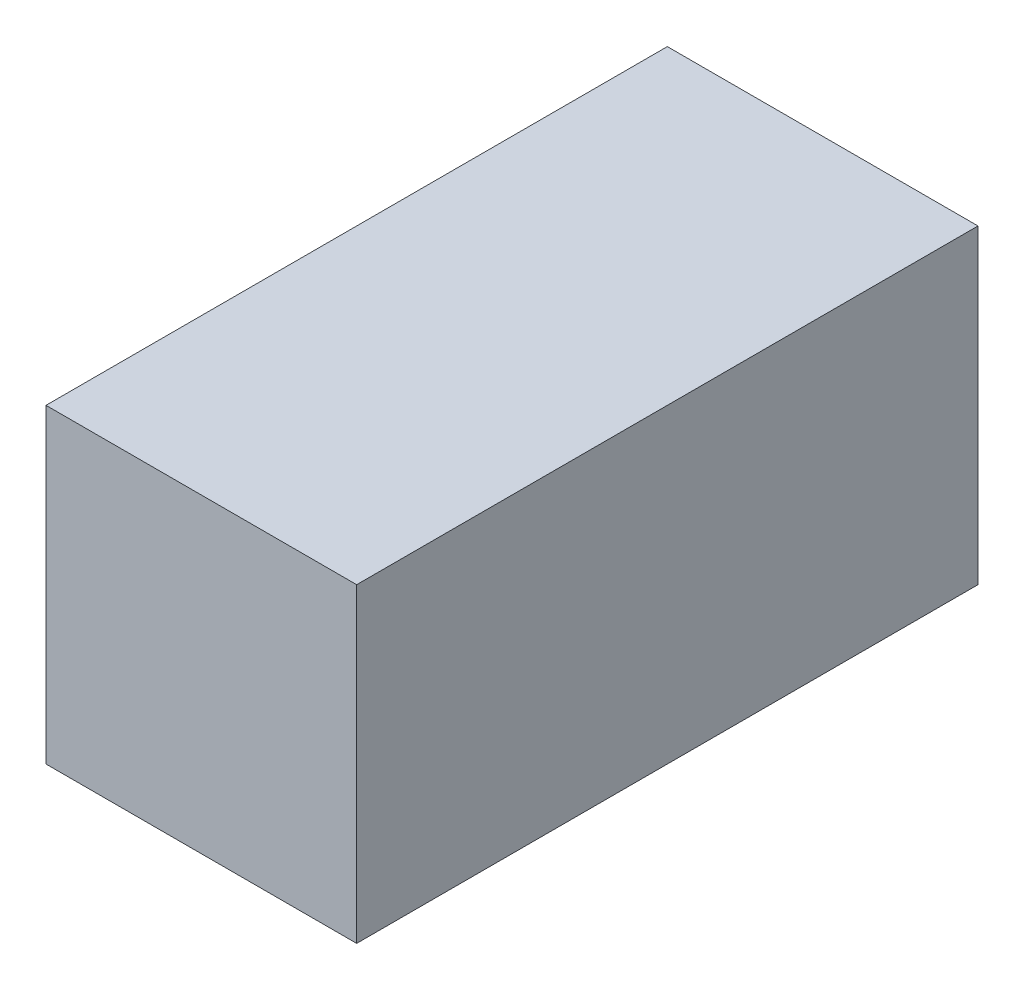
ISO-10303-21;
HEADER;
FILE_DESCRIPTION(('STEP AP214'),'2;1');
FILE_NAME('part.step','',(''),(''),'','','');
FILE_SCHEMA(('AUTOMOTIVE_DESIGN { 1 0 10303 214 1 1 1 1 }'));
ENDSEC;
DATA;
#1=APPLICATION_CONTEXT('core data for automotive mechanical design processes');
#2=APPLICATION_PROTOCOL_DEFINITION('international standard','automotive_design',2000,#1);
#3=PRODUCT_CONTEXT('',#1,'mechanical');
#4=PRODUCT('Part','Part','',(#3));
#5=PRODUCT_RELATED_PRODUCT_CATEGORY('part','',(#4));
#6=PRODUCT_DEFINITION_FORMATION('','',#4);
#7=PRODUCT_DEFINITION_CONTEXT('part definition',#1,'design');
#8=PRODUCT_DEFINITION('design','',#6,#7);
#9=PRODUCT_DEFINITION_SHAPE('','',#8);
#10=(LENGTH_UNIT() NAMED_UNIT(*) SI_UNIT(.MILLI.,.METRE.));
#11=(NAMED_UNIT(*) PLANE_ANGLE_UNIT() SI_UNIT($,.RADIAN.));
#12=(NAMED_UNIT(*) SI_UNIT($,.STERADIAN.) SOLID_ANGLE_UNIT());
#13=UNCERTAINTY_MEASURE_WITH_UNIT(LENGTH_MEASURE(1.E-05),#10,'distance_accuracy_value','');
#14=(GEOMETRIC_REPRESENTATION_CONTEXT(3) GLOBAL_UNCERTAINTY_ASSIGNED_CONTEXT((#13)) GLOBAL_UNIT_ASSIGNED_CONTEXT((#10,
#11,#12)) REPRESENTATION_CONTEXT('',''));
#15=CARTESIAN_POINT('',(0.,0.,0.));
#16=DIRECTION('',(0.,0.,1.));
#17=DIRECTION('',(1.,0.,0.));
#18=AXIS2_PLACEMENT_3D('',#15,#16,#17);
#19=CARTESIAN_POINT('',(5.,0.,10.));
#20=DIRECTION('',(-1.,0.,0.));
#21=DIRECTION('',(0.,0.,1.));
#22=AXIS2_PLACEMENT_3D('',#19,#20,#21);
#23=PLANE('',#22);
#24=DIRECTION('',(0.,1.,0.));
#25=VECTOR('',#24,1.);
#26=CARTESIAN_POINT('',(5.,0.,0.));
#27=LINE('',#26,#25);
#28=CARTESIAN_POINT('',(5.,5.,0.));
#29=VERTEX_POINT('',#28);
#30=CARTESIAN_POINT('',(5.,10.,0.));
#31=VERTEX_POINT('',#30);
#32=EDGE_CURVE('E110',#29,#31,#27,.T.);
#33=ORIENTED_EDGE('',*,*,#32,.F.);
#34=DIRECTION('',(0.,0.,-1.));
#35=VECTOR('',#34,1.);
#36=CARTESIAN_POINT('',(5.,5.,10.));
#37=LINE('',#36,#35);
#38=CARTESIAN_POINT('',(5.,5.,10.));
#39=VERTEX_POINT('',#38);
#40=EDGE_CURVE('E11',#39,#29,#37,.T.);
#41=ORIENTED_EDGE('',*,*,#40,.F.);
#42=DIRECTION('',(0.,1.,0.));
#43=VECTOR('',#42,1.);
#44=CARTESIAN_POINT('',(5.,0.,10.));
#45=LINE('',#44,#43);
#46=CARTESIAN_POINT('',(5.,10.,10.));
#47=VERTEX_POINT('',#46);
#48=EDGE_CURVE('E95',#39,#47,#45,.T.);
#49=ORIENTED_EDGE('',*,*,#48,.T.);
#50=DIRECTION('',(0.,0.,-1.));
#51=VECTOR('',#50,1.);
#52=CARTESIAN_POINT('',(5.,10.,10.));
#53=LINE('',#52,#51);
#54=EDGE_CURVE('E58',#47,#31,#53,.T.);
#55=ORIENTED_EDGE('',*,*,#54,.T.);
#56=EDGE_LOOP('',(#33,#41,#49,#55));
#57=FACE_BOUND('',#56,.T.);
#58=ADVANCED_FACE('F42',(#57),#23,.T.);
#59=CARTESIAN_POINT('',(0.,5.,10.));
#60=DIRECTION('',(0.,1.,0.));
#61=DIRECTION('',(0.,0.,1.));
#62=AXIS2_PLACEMENT_3D('',#59,#60,#61);
#63=PLANE('',#62);
#64=DIRECTION('',(1.,0.,0.));
#65=VECTOR('',#64,1.);
#66=CARTESIAN_POINT('',(0.,5.,0.));
#67=LINE('',#66,#65);
#68=CARTESIAN_POINT('',(10.,5.,0.));
#69=VERTEX_POINT('',#68);
#70=EDGE_CURVE('E98',#29,#69,#67,.T.);
#71=ORIENTED_EDGE('',*,*,#70,.T.);
#72=DIRECTION('',(0.,0.,-1.));
#73=VECTOR('',#72,1.);
#74=CARTESIAN_POINT('',(10.,5.,10.));
#75=LINE('',#74,#73);
#76=CARTESIAN_POINT('',(10.,5.,10.));
#77=VERTEX_POINT('',#76);
#78=EDGE_CURVE('E55',#77,#69,#75,.T.);
#79=ORIENTED_EDGE('',*,*,#78,.F.);
#80=DIRECTION('',(1.,0.,0.));
#81=VECTOR('',#80,1.);
#82=CARTESIAN_POINT('',(0.,5.,10.));
#83=LINE('',#82,#81);
#84=EDGE_CURVE('E88',#39,#77,#83,.T.);
#85=ORIENTED_EDGE('',*,*,#84,.F.);
#86=ORIENTED_EDGE('',*,*,#40,.T.);
#87=EDGE_LOOP('',(#71,#79,#85,#86));
#88=FACE_BOUND('',#87,.T.);
#89=ADVANCED_FACE('F96',(#88),#63,.F.);
#90=CARTESIAN_POINT('',(10.,0.,10.));
#91=DIRECTION('',(-1.,0.,0.));
#92=DIRECTION('',(0.,0.,1.));
#93=AXIS2_PLACEMENT_3D('',#90,#91,#92);
#94=PLANE('',#93);
#95=DIRECTION('',(0.,1.,0.));
#96=VECTOR('',#95,1.);
#97=CARTESIAN_POINT('',(10.,0.,0.));
#98=LINE('',#97,#96);
#99=CARTESIAN_POINT('',(10.,10.,0.));
#100=VERTEX_POINT('',#99);
#101=EDGE_CURVE('E109',#69,#100,#98,.T.);
#102=ORIENTED_EDGE('',*,*,#101,.T.);
#103=DIRECTION('',(0.,0.,-1.));
#104=VECTOR('',#103,1.);
#105=CARTESIAN_POINT('',(10.,10.,10.));
#106=LINE('',#105,#104);
#107=CARTESIAN_POINT('',(10.,10.,10.));
#108=VERTEX_POINT('',#107);
#109=EDGE_CURVE('E74',#108,#100,#106,.T.);
#110=ORIENTED_EDGE('',*,*,#109,.F.);
#111=DIRECTION('',(0.,1.,0.));
#112=VECTOR('',#111,1.);
#113=CARTESIAN_POINT('',(10.,0.,10.));
#114=LINE('',#113,#112);
#115=EDGE_CURVE('E93',#77,#108,#114,.T.);
#116=ORIENTED_EDGE('',*,*,#115,.F.);
#117=ORIENTED_EDGE('',*,*,#78,.T.);
#118=EDGE_LOOP('',(#102,#110,#116,#117));
#119=FACE_BOUND('',#118,.T.);
#120=ADVANCED_FACE('F101',(#119),#94,.F.);
#121=CARTESIAN_POINT('',(0.,10.,10.));
#122=DIRECTION('',(0.,1.,0.));
#123=DIRECTION('',(0.,0.,1.));
#124=AXIS2_PLACEMENT_3D('',#121,#122,#123);
#125=PLANE('',#124);
#126=DIRECTION('',(1.,0.,0.));
#127=VECTOR('',#126,1.);
#128=CARTESIAN_POINT('',(0.,10.,0.));
#129=LINE('',#128,#127);
#130=EDGE_CURVE('E115',#31,#100,#129,.T.);
#131=ORIENTED_EDGE('',*,*,#130,.F.);
#132=ORIENTED_EDGE('',*,*,#54,.F.);
#133=DIRECTION('',(1.,0.,0.));
#134=VECTOR('',#133,1.);
#135=CARTESIAN_POINT('',(0.,10.,10.));
#136=LINE('',#135,#134);
#137=EDGE_CURVE('E105',#47,#108,#136,.T.);
#138=ORIENTED_EDGE('',*,*,#137,.T.);
#139=ORIENTED_EDGE('',*,*,#109,.T.);
#140=EDGE_LOOP('',(#131,#132,#138,#139));
#141=FACE_BOUND('',#140,.T.);
#142=ADVANCED_FACE('F119',(#141),#125,.T.);
#143=CARTESIAN_POINT('',(0.,0.,10.));
#144=DIRECTION('',(0.,0.,1.));
#145=DIRECTION('',(1.,0.,0.));
#146=AXIS2_PLACEMENT_3D('',#143,#144,#145);
#147=PLANE('',#146);
#148=ORIENTED_EDGE('',*,*,#48,.F.);
#149=ORIENTED_EDGE('',*,*,#84,.T.);
#150=ORIENTED_EDGE('',*,*,#115,.T.);
#151=ORIENTED_EDGE('',*,*,#137,.F.);
#152=EDGE_LOOP('',(#148,#149,#150,#151));
#153=FACE_BOUND('',#152,.T.);
#154=ADVANCED_FACE('F86',(#153),#147,.T.);
#155=CARTESIAN_POINT('',(0.,0.,0.));
#156=DIRECTION('',(0.,0.,1.));
#157=DIRECTION('',(1.,0.,0.));
#158=AXIS2_PLACEMENT_3D('',#155,#156,#157);
#159=PLANE('',#158);
#160=ORIENTED_EDGE('',*,*,#32,.T.);
#161=ORIENTED_EDGE('',*,*,#130,.T.);
#162=ORIENTED_EDGE('',*,*,#101,.F.);
#163=ORIENTED_EDGE('',*,*,#70,.F.);
#164=EDGE_LOOP('',(#160,#161,#162,#163));
#165=FACE_BOUND('',#164,.T.);
#166=ADVANCED_FACE('F122',(#165),#159,.F.);
#167=CLOSED_SHELL('',(#58,#89,#120,#142,#154,#166));
#168=MANIFOLD_SOLID_BREP('B2',#167);
#169=ADVANCED_BREP_SHAPE_REPRESENTATION('',(#18,#168),#14);
#170=SHAPE_DEFINITION_REPRESENTATION(#9,#169);
ENDSEC;
END-ISO-10303-21;
